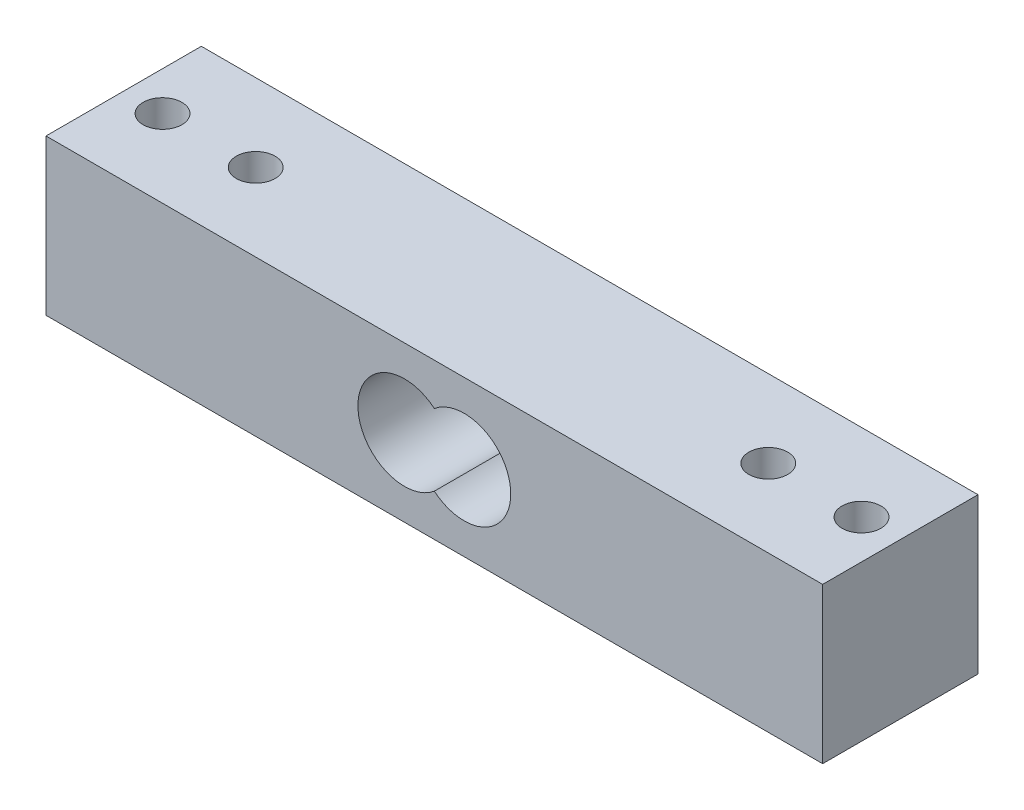
ISO-10303-21;
HEADER;
FILE_DESCRIPTION(('STEP AP214'),'2;1');
FILE_NAME('part.step','',(''),(''),'','','');
FILE_SCHEMA(('AUTOMOTIVE_DESIGN { 1 0 10303 214 1 1 1 1 }'));
ENDSEC;
DATA;
#1=APPLICATION_CONTEXT('core data for automotive mechanical design processes');
#2=APPLICATION_PROTOCOL_DEFINITION('international standard','automotive_design',2000,#1);
#3=PRODUCT_CONTEXT('',#1,'mechanical');
#4=PRODUCT('Part','Part','',(#3));
#5=PRODUCT_RELATED_PRODUCT_CATEGORY('part','',(#4));
#6=PRODUCT_DEFINITION_FORMATION('','',#4);
#7=PRODUCT_DEFINITION_CONTEXT('part definition',#1,'design');
#8=PRODUCT_DEFINITION('design','',#6,#7);
#9=PRODUCT_DEFINITION_SHAPE('','',#8);
#10=(LENGTH_UNIT() NAMED_UNIT(*) SI_UNIT(.MILLI.,.METRE.));
#11=(NAMED_UNIT(*) PLANE_ANGLE_UNIT() SI_UNIT($,.RADIAN.));
#12=(NAMED_UNIT(*) SI_UNIT($,.STERADIAN.) SOLID_ANGLE_UNIT());
#13=UNCERTAINTY_MEASURE_WITH_UNIT(LENGTH_MEASURE(1.E-05),#10,'distance_accuracy_value','');
#14=(GEOMETRIC_REPRESENTATION_CONTEXT(3) GLOBAL_UNCERTAINTY_ASSIGNED_CONTEXT((#13)) GLOBAL_UNIT_ASSIGNED_CONTEXT((#10,
#11,#12)) REPRESENTATION_CONTEXT('',''));
#15=CARTESIAN_POINT('',(0.,0.,0.));
#16=DIRECTION('',(0.,0.,1.));
#17=DIRECTION('',(1.,0.,0.));
#18=AXIS2_PLACEMENT_3D('',#15,#16,#17);
#19=CARTESIAN_POINT('',(0.,0.,10.));
#20=DIRECTION('',(0.,0.,-1.));
#21=DIRECTION('',(-1.,0.,0.));
#22=AXIS2_PLACEMENT_3D('',#19,#20,#21);
#23=PLANE('',#22);
#24=DIRECTION('',(0.,-1.,0.));
#25=VECTOR('',#24,1.);
#26=CARTESIAN_POINT('',(-25.,4.99999999999999,10.));
#27=LINE('',#26,#25);
#28=CARTESIAN_POINT('',(-25.,4.99999999999999,10.));
#29=VERTEX_POINT('',#28);
#30=CARTESIAN_POINT('',(-25.,-5.,10.));
#31=VERTEX_POINT('',#30);
#32=EDGE_CURVE('E108',#29,#31,#27,.T.);
#33=ORIENTED_EDGE('',*,*,#32,.T.);
#34=DIRECTION('',(1.,0.,0.));
#35=VECTOR('',#34,1.);
#36=CARTESIAN_POINT('',(25.,-5.,10.));
#37=LINE('',#36,#35);
#38=CARTESIAN_POINT('',(25.,-5.,10.));
#39=VERTEX_POINT('',#38);
#40=EDGE_CURVE('E111',#31,#39,#37,.T.);
#41=ORIENTED_EDGE('',*,*,#40,.T.);
#42=DIRECTION('',(0.,1.,0.));
#43=VECTOR('',#42,1.);
#44=CARTESIAN_POINT('',(25.,5.,10.));
#45=LINE('',#44,#43);
#46=CARTESIAN_POINT('',(25.,5.,10.));
#47=VERTEX_POINT('',#46);
#48=EDGE_CURVE('E114',#39,#47,#45,.T.);
#49=ORIENTED_EDGE('',*,*,#48,.T.);
#50=DIRECTION('',(-1.,0.,0.));
#51=VECTOR('',#50,1.);
#52=CARTESIAN_POINT('',(25.,5.,10.));
#53=LINE('',#52,#51);
#54=EDGE_CURVE('E116',#47,#29,#53,.T.);
#55=ORIENTED_EDGE('',*,*,#54,.T.);
#56=EDGE_LOOP('',(#33,#41,#49,#55));
#57=FACE_BOUND('',#56,.T.);
#58=CARTESIAN_POINT('',(1.92047642736452,0.,10.));
#59=DIRECTION('',(0.,0.,1.));
#60=DIRECTION('',(-1.,0.,0.));
#61=AXIS2_PLACEMENT_3D('',#58,#59,#60);
#62=CIRCLE('',#61,3.);
#63=CARTESIAN_POINT('',(0.,-2.30472781298296,10.));
#64=VERTEX_POINT('',#63);
#65=CARTESIAN_POINT('',(0.,2.30472781298295,10.));
#66=VERTEX_POINT('',#65);
#67=EDGE_CURVE('E94',#64,#66,#62,.T.);
#68=ORIENTED_EDGE('',*,*,#67,.F.);
#69=CARTESIAN_POINT('',(-1.92047642736453,0.,10.));
#70=DIRECTION('',(0.,0.,1.));
#71=DIRECTION('',(1.,0.,0.));
#72=AXIS2_PLACEMENT_3D('',#69,#70,#71);
#73=CIRCLE('',#72,3.);
#74=EDGE_CURVE('E88',#66,#64,#73,.T.);
#75=ORIENTED_EDGE('',*,*,#74,.F.);
#76=EDGE_LOOP('',(#68,#75));
#77=FACE_BOUND('',#76,.T.);
#78=ADVANCED_FACE('F36',(#57,#77),#23,.F.);
#79=CARTESIAN_POINT('',(0.,0.,0.));
#80=DIRECTION('',(0.,0.,-1.));
#81=DIRECTION('',(-1.,0.,0.));
#82=AXIS2_PLACEMENT_3D('',#79,#80,#81);
#83=PLANE('',#82);
#84=DIRECTION('',(0.,-1.,0.));
#85=VECTOR('',#84,1.);
#86=CARTESIAN_POINT('',(-25.,4.99999999999999,0.));
#87=LINE('',#86,#85);
#88=CARTESIAN_POINT('',(-25.,4.99999999999999,0.));
#89=VERTEX_POINT('',#88);
#90=CARTESIAN_POINT('',(-25.,-5.,0.));
#91=VERTEX_POINT('',#90);
#92=EDGE_CURVE('E107',#89,#91,#87,.T.);
#93=ORIENTED_EDGE('',*,*,#92,.F.);
#94=DIRECTION('',(-1.,0.,0.));
#95=VECTOR('',#94,1.);
#96=CARTESIAN_POINT('',(25.,5.,0.));
#97=LINE('',#96,#95);
#98=CARTESIAN_POINT('',(25.,5.,0.));
#99=VERTEX_POINT('',#98);
#100=EDGE_CURVE('E112',#99,#89,#97,.T.);
#101=ORIENTED_EDGE('',*,*,#100,.F.);
#102=DIRECTION('',(0.,1.,0.));
#103=VECTOR('',#102,1.);
#104=CARTESIAN_POINT('',(25.,5.,0.));
#105=LINE('',#104,#103);
#106=CARTESIAN_POINT('',(25.,-5.,0.));
#107=VERTEX_POINT('',#106);
#108=EDGE_CURVE('E123',#107,#99,#105,.T.);
#109=ORIENTED_EDGE('',*,*,#108,.F.);
#110=DIRECTION('',(1.,0.,0.));
#111=VECTOR('',#110,1.);
#112=CARTESIAN_POINT('',(25.,-5.,0.));
#113=LINE('',#112,#111);
#114=EDGE_CURVE('E121',#91,#107,#113,.T.);
#115=ORIENTED_EDGE('',*,*,#114,.F.);
#116=EDGE_LOOP('',(#93,#101,#109,#115));
#117=FACE_BOUND('',#116,.T.);
#118=CARTESIAN_POINT('',(-1.92047642736453,0.,0.));
#119=DIRECTION('',(0.,0.,1.));
#120=DIRECTION('',(1.,0.,0.));
#121=AXIS2_PLACEMENT_3D('',#118,#119,#120);
#122=CIRCLE('',#121,3.);
#123=CARTESIAN_POINT('',(0.,2.30472781298295,0.));
#124=VERTEX_POINT('',#123);
#125=CARTESIAN_POINT('',(0.,-2.30472781298296,0.));
#126=VERTEX_POINT('',#125);
#127=EDGE_CURVE('E98',#124,#126,#122,.T.);
#128=ORIENTED_EDGE('',*,*,#127,.T.);
#129=CARTESIAN_POINT('',(1.92047642736452,0.,0.));
#130=DIRECTION('',(0.,0.,1.));
#131=DIRECTION('',(-1.,0.,0.));
#132=AXIS2_PLACEMENT_3D('',#129,#130,#131);
#133=CIRCLE('',#132,3.);
#134=EDGE_CURVE('E58',#126,#124,#133,.T.);
#135=ORIENTED_EDGE('',*,*,#134,.T.);
#136=EDGE_LOOP('',(#128,#135));
#137=FACE_BOUND('',#136,.T.);
#138=ADVANCED_FACE('F141',(#117,#137),#83,.T.);
#139=CARTESIAN_POINT('',(-25.,4.99999999999999,10.));
#140=DIRECTION('',(1.,0.,0.));
#141=DIRECTION('',(0.,0.,-1.));
#142=AXIS2_PLACEMENT_3D('',#139,#140,#141);
#143=PLANE('',#142);
#144=ORIENTED_EDGE('',*,*,#92,.T.);
#145=DIRECTION('',(0.,0.,-1.));
#146=VECTOR('',#145,1.);
#147=CARTESIAN_POINT('',(-25.,-5.,10.));
#148=LINE('',#147,#146);
#149=EDGE_CURVE('E11',#31,#91,#148,.T.);
#150=ORIENTED_EDGE('',*,*,#149,.F.);
#151=ORIENTED_EDGE('',*,*,#32,.F.);
#152=DIRECTION('',(0.,0.,-1.));
#153=VECTOR('',#152,1.);
#154=CARTESIAN_POINT('',(-25.,4.99999999999999,10.));
#155=LINE('',#154,#153);
#156=EDGE_CURVE('E118',#29,#89,#155,.T.);
#157=ORIENTED_EDGE('',*,*,#156,.T.);
#158=EDGE_LOOP('',(#144,#150,#151,#157));
#159=FACE_BOUND('',#158,.T.);
#160=ADVANCED_FACE('F38',(#159),#143,.F.);
#161=CARTESIAN_POINT('',(25.,-5.,10.));
#162=DIRECTION('',(0.,1.,0.));
#163=DIRECTION('',(-1.,0.,0.));
#164=AXIS2_PLACEMENT_3D('',#161,#162,#163);
#165=PLANE('',#164);
#166=CARTESIAN_POINT('',(22.5,-5.00000000000002,5.));
#167=DIRECTION('',(0.,1.,0.));
#168=DIRECTION('',(0.,0.,1.));
#169=AXIS2_PLACEMENT_3D('',#166,#167,#168);
#170=CIRCLE('',#169,1.25);
#171=CARTESIAN_POINT('',(22.5,-5.00000000000002,6.25));
#172=VERTEX_POINT('',#171);
#173=EDGE_CURVE('E201',#172,#172,#170,.T.);
#174=ORIENTED_EDGE('',*,*,#173,.T.);
#175=EDGE_LOOP('',(#174));
#176=FACE_BOUND('',#175,.T.);
#177=CARTESIAN_POINT('',(16.5,-5.00000000000002,5.));
#178=DIRECTION('',(0.,1.,0.));
#179=DIRECTION('',(0.,0.,1.));
#180=AXIS2_PLACEMENT_3D('',#177,#178,#179);
#181=CIRCLE('',#180,1.25);
#182=CARTESIAN_POINT('',(16.5,-5.00000000000002,6.25));
#183=VERTEX_POINT('',#182);
#184=EDGE_CURVE('E197',#183,#183,#181,.T.);
#185=ORIENTED_EDGE('',*,*,#184,.T.);
#186=EDGE_LOOP('',(#185));
#187=FACE_BOUND('',#186,.T.);
#188=CARTESIAN_POINT('',(-22.5,-5.00000000000001,5.));
#189=DIRECTION('',(0.,1.,0.));
#190=DIRECTION('',(0.,0.,1.));
#191=AXIS2_PLACEMENT_3D('',#188,#189,#190);
#192=CIRCLE('',#191,1.25);
#193=CARTESIAN_POINT('',(-22.5,-5.00000000000001,6.25));
#194=VERTEX_POINT('',#193);
#195=EDGE_CURVE('E191',#194,#194,#192,.T.);
#196=ORIENTED_EDGE('',*,*,#195,.T.);
#197=EDGE_LOOP('',(#196));
#198=FACE_BOUND('',#197,.T.);
#199=CARTESIAN_POINT('',(-16.5,-5.00000000000001,5.));
#200=DIRECTION('',(0.,1.,0.));
#201=DIRECTION('',(0.,0.,1.));
#202=AXIS2_PLACEMENT_3D('',#199,#200,#201);
#203=CIRCLE('',#202,1.25);
#204=CARTESIAN_POINT('',(-16.5,-5.00000000000001,6.25));
#205=VERTEX_POINT('',#204);
#206=EDGE_CURVE('E102',#205,#205,#203,.T.);
#207=ORIENTED_EDGE('',*,*,#206,.T.);
#208=EDGE_LOOP('',(#207));
#209=FACE_BOUND('',#208,.T.);
#210=ORIENTED_EDGE('',*,*,#114,.T.);
#211=DIRECTION('',(0.,0.,-1.));
#212=VECTOR('',#211,1.);
#213=CARTESIAN_POINT('',(25.,-5.,10.));
#214=LINE('',#213,#212);
#215=EDGE_CURVE('E44',#39,#107,#214,.T.);
#216=ORIENTED_EDGE('',*,*,#215,.F.);
#217=ORIENTED_EDGE('',*,*,#40,.F.);
#218=ORIENTED_EDGE('',*,*,#149,.T.);
#219=EDGE_LOOP('',(#210,#216,#217,#218));
#220=FACE_BOUND('',#219,.T.);
#221=ADVANCED_FACE('F151',(#176,#187,#198,#209,#220),#165,.F.);
#222=CARTESIAN_POINT('',(25.,5.,10.));
#223=DIRECTION('',(-1.,0.,0.));
#224=DIRECTION('',(0.,0.,1.));
#225=AXIS2_PLACEMENT_3D('',#222,#223,#224);
#226=PLANE('',#225);
#227=ORIENTED_EDGE('',*,*,#108,.T.);
#228=DIRECTION('',(0.,0.,-1.));
#229=VECTOR('',#228,1.);
#230=CARTESIAN_POINT('',(25.,5.,10.));
#231=LINE('',#230,#229);
#232=EDGE_CURVE('E128',#47,#99,#231,.T.);
#233=ORIENTED_EDGE('',*,*,#232,.F.);
#234=ORIENTED_EDGE('',*,*,#48,.F.);
#235=ORIENTED_EDGE('',*,*,#215,.T.);
#236=EDGE_LOOP('',(#227,#233,#234,#235));
#237=FACE_BOUND('',#236,.T.);
#238=ADVANCED_FACE('F135',(#237),#226,.F.);
#239=CARTESIAN_POINT('',(25.,5.,10.));
#240=DIRECTION('',(0.,-1.,0.));
#241=DIRECTION('',(1.,0.,0.));
#242=AXIS2_PLACEMENT_3D('',#239,#240,#241);
#243=PLANE('',#242);
#244=CARTESIAN_POINT('',(22.5,5.,5.));
#245=DIRECTION('',(0.,1.,0.));
#246=DIRECTION('',(0.,0.,1.));
#247=AXIS2_PLACEMENT_3D('',#244,#245,#246);
#248=CIRCLE('',#247,1.25);
#249=CARTESIAN_POINT('',(22.5,5.,6.25));
#250=VERTEX_POINT('',#249);
#251=EDGE_CURVE('E178',#250,#250,#248,.T.);
#252=ORIENTED_EDGE('',*,*,#251,.F.);
#253=EDGE_LOOP('',(#252));
#254=FACE_BOUND('',#253,.T.);
#255=CARTESIAN_POINT('',(16.5,5.,5.));
#256=DIRECTION('',(0.,1.,0.));
#257=DIRECTION('',(0.,0.,1.));
#258=AXIS2_PLACEMENT_3D('',#255,#256,#257);
#259=CIRCLE('',#258,1.25);
#260=CARTESIAN_POINT('',(16.5,5.,6.25));
#261=VERTEX_POINT('',#260);
#262=EDGE_CURVE('E182',#261,#261,#259,.T.);
#263=ORIENTED_EDGE('',*,*,#262,.F.);
#264=EDGE_LOOP('',(#263));
#265=FACE_BOUND('',#264,.T.);
#266=CARTESIAN_POINT('',(-22.5,5.,5.));
#267=DIRECTION('',(0.,1.,0.));
#268=DIRECTION('',(0.,0.,1.));
#269=AXIS2_PLACEMENT_3D('',#266,#267,#268);
#270=CIRCLE('',#269,1.25);
#271=CARTESIAN_POINT('',(-22.5,5.,6.25));
#272=VERTEX_POINT('',#271);
#273=EDGE_CURVE('E186',#272,#272,#270,.T.);
#274=ORIENTED_EDGE('',*,*,#273,.F.);
#275=EDGE_LOOP('',(#274));
#276=FACE_BOUND('',#275,.T.);
#277=CARTESIAN_POINT('',(-16.5,5.,5.));
#278=DIRECTION('',(0.,1.,0.));
#279=DIRECTION('',(0.,0.,1.));
#280=AXIS2_PLACEMENT_3D('',#277,#278,#279);
#281=CIRCLE('',#280,1.25);
#282=CARTESIAN_POINT('',(-16.5,5.,6.25));
#283=VERTEX_POINT('',#282);
#284=EDGE_CURVE('E189',#283,#283,#281,.T.);
#285=ORIENTED_EDGE('',*,*,#284,.F.);
#286=EDGE_LOOP('',(#285));
#287=FACE_BOUND('',#286,.T.);
#288=ORIENTED_EDGE('',*,*,#100,.T.);
#289=ORIENTED_EDGE('',*,*,#156,.F.);
#290=ORIENTED_EDGE('',*,*,#54,.F.);
#291=ORIENTED_EDGE('',*,*,#232,.T.);
#292=EDGE_LOOP('',(#288,#289,#290,#291));
#293=FACE_BOUND('',#292,.T.);
#294=ADVANCED_FACE('F145',(#254,#265,#276,#287,#293),#243,.F.);
#295=CARTESIAN_POINT('',(1.92047642736452,0.,10.));
#296=DIRECTION('',(0.,0.,-1.));
#297=DIRECTION('',(-1.,0.,0.));
#298=AXIS2_PLACEMENT_3D('',#295,#296,#297);
#299=CYLINDRICAL_SURFACE('',#298,3.);
#300=ORIENTED_EDGE('',*,*,#134,.F.);
#301=DIRECTION('',(0.,0.,-1.));
#302=VECTOR('',#301,1.);
#303=CARTESIAN_POINT('',(0.,-2.30472781298296,10.));
#304=LINE('',#303,#302);
#305=EDGE_CURVE('E90',#64,#126,#304,.T.);
#306=ORIENTED_EDGE('',*,*,#305,.F.);
#307=ORIENTED_EDGE('',*,*,#67,.T.);
#308=DIRECTION('',(0.,0.,-1.));
#309=VECTOR('',#308,1.);
#310=CARTESIAN_POINT('',(0.,2.30472781298295,10.));
#311=LINE('',#310,#309);
#312=EDGE_CURVE('E51',#66,#124,#311,.T.);
#313=ORIENTED_EDGE('',*,*,#312,.T.);
#314=EDGE_LOOP('',(#300,#306,#307,#313));
#315=FACE_BOUND('',#314,.T.);
#316=ADVANCED_FACE('F96',(#315),#299,.F.);
#317=CARTESIAN_POINT('',(-1.92047642736453,0.,10.));
#318=DIRECTION('',(0.,0.,-1.));
#319=DIRECTION('',(-1.,0.,0.));
#320=AXIS2_PLACEMENT_3D('',#317,#318,#319);
#321=CYLINDRICAL_SURFACE('',#320,3.);
#322=ORIENTED_EDGE('',*,*,#127,.F.);
#323=ORIENTED_EDGE('',*,*,#312,.F.);
#324=ORIENTED_EDGE('',*,*,#74,.T.);
#325=ORIENTED_EDGE('',*,*,#305,.T.);
#326=EDGE_LOOP('',(#322,#323,#324,#325));
#327=FACE_BOUND('',#326,.T.);
#328=ADVANCED_FACE('F89',(#327),#321,.F.);
#329=CARTESIAN_POINT('',(-16.5,5.,5.));
#330=DIRECTION('',(0.,1.,0.));
#331=DIRECTION('',(0.,0.,1.));
#332=AXIS2_PLACEMENT_3D('',#329,#330,#331);
#333=CYLINDRICAL_SURFACE('',#332,1.25);
#334=ORIENTED_EDGE('',*,*,#206,.F.);
#335=EDGE_LOOP('',(#334));
#336=FACE_BOUND('',#335,.T.);
#337=ORIENTED_EDGE('',*,*,#284,.T.);
#338=EDGE_LOOP('',(#337));
#339=FACE_BOUND('',#338,.T.);
#340=ADVANCED_FACE('F219',(#336,#339),#333,.F.);
#341=CARTESIAN_POINT('',(-22.5,5.,5.));
#342=DIRECTION('',(0.,1.,0.));
#343=DIRECTION('',(0.,0.,1.));
#344=AXIS2_PLACEMENT_3D('',#341,#342,#343);
#345=CYLINDRICAL_SURFACE('',#344,1.25);
#346=ORIENTED_EDGE('',*,*,#195,.F.);
#347=EDGE_LOOP('',(#346));
#348=FACE_BOUND('',#347,.T.);
#349=ORIENTED_EDGE('',*,*,#273,.T.);
#350=EDGE_LOOP('',(#349));
#351=FACE_BOUND('',#350,.T.);
#352=ADVANCED_FACE('F212',(#348,#351),#345,.F.);
#353=CARTESIAN_POINT('',(16.5,5.,5.));
#354=DIRECTION('',(0.,1.,0.));
#355=DIRECTION('',(0.,0.,1.));
#356=AXIS2_PLACEMENT_3D('',#353,#354,#355);
#357=CYLINDRICAL_SURFACE('',#356,1.25);
#358=ORIENTED_EDGE('',*,*,#184,.F.);
#359=EDGE_LOOP('',(#358));
#360=FACE_BOUND('',#359,.T.);
#361=ORIENTED_EDGE('',*,*,#262,.T.);
#362=EDGE_LOOP('',(#361));
#363=FACE_BOUND('',#362,.T.);
#364=ADVANCED_FACE('F206',(#360,#363),#357,.F.);
#365=CARTESIAN_POINT('',(22.5,5.,5.));
#366=DIRECTION('',(0.,1.,0.));
#367=DIRECTION('',(0.,0.,1.));
#368=AXIS2_PLACEMENT_3D('',#365,#366,#367);
#369=CYLINDRICAL_SURFACE('',#368,1.25);
#370=ORIENTED_EDGE('',*,*,#173,.F.);
#371=EDGE_LOOP('',(#370));
#372=FACE_BOUND('',#371,.T.);
#373=ORIENTED_EDGE('',*,*,#251,.T.);
#374=EDGE_LOOP('',(#373));
#375=FACE_BOUND('',#374,.T.);
#376=ADVANCED_FACE('F204',(#372,#375),#369,.F.);
#377=CLOSED_SHELL('',(#78,#138,#160,#221,#238,#294,#316,#328,#340,#352,#364,#376));
#378=MANIFOLD_SOLID_BREP('B2',#377);
#379=ADVANCED_BREP_SHAPE_REPRESENTATION('',(#18,#378),#14);
#380=SHAPE_DEFINITION_REPRESENTATION(#9,#379);
ENDSEC;
END-ISO-10303-21;
